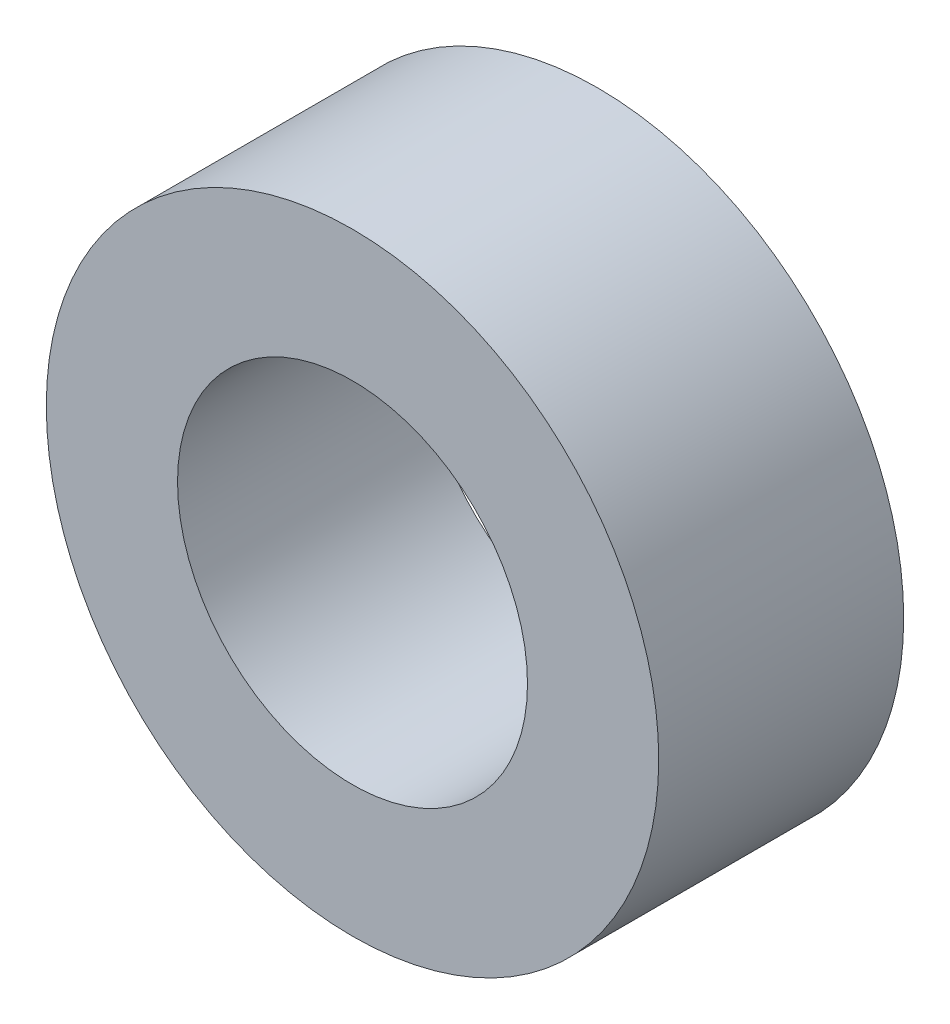
ISO-10303-21;
HEADER;
FILE_DESCRIPTION(('STEP AP214'),'2;1');
FILE_NAME('part.step','',(''),(''),'','','');
FILE_SCHEMA(('AUTOMOTIVE_DESIGN { 1 0 10303 214 1 1 1 1 }'));
ENDSEC;
DATA;
#1=APPLICATION_CONTEXT('core data for automotive mechanical design processes');
#2=APPLICATION_PROTOCOL_DEFINITION('international standard','automotive_design',2000,#1);
#3=PRODUCT_CONTEXT('',#1,'mechanical');
#4=PRODUCT('Part','Part','',(#3));
#5=PRODUCT_RELATED_PRODUCT_CATEGORY('part','',(#4));
#6=PRODUCT_DEFINITION_FORMATION('','',#4);
#7=PRODUCT_DEFINITION_CONTEXT('part definition',#1,'design');
#8=PRODUCT_DEFINITION('design','',#6,#7);
#9=PRODUCT_DEFINITION_SHAPE('','',#8);
#10=(LENGTH_UNIT() NAMED_UNIT(*) SI_UNIT(.MILLI.,.METRE.));
#11=(NAMED_UNIT(*) PLANE_ANGLE_UNIT() SI_UNIT($,.RADIAN.));
#12=(NAMED_UNIT(*) SI_UNIT($,.STERADIAN.) SOLID_ANGLE_UNIT());
#13=UNCERTAINTY_MEASURE_WITH_UNIT(LENGTH_MEASURE(1.E-05),#10,'distance_accuracy_value','');
#14=(GEOMETRIC_REPRESENTATION_CONTEXT(3) GLOBAL_UNCERTAINTY_ASSIGNED_CONTEXT((#13)) GLOBAL_UNIT_ASSIGNED_CONTEXT((#10,
#11,#12)) REPRESENTATION_CONTEXT('',''));
#15=CARTESIAN_POINT('',(0.,0.,0.));
#16=DIRECTION('',(0.,0.,1.));
#17=DIRECTION('',(1.,0.,0.));
#18=AXIS2_PLACEMENT_3D('',#15,#16,#17);
#19=CARTESIAN_POINT('',(0.403421843265389,-40.0666634220305,14.));
#20=DIRECTION('',(0.,0.,1.));
#21=DIRECTION('',(1.,0.,0.));
#22=AXIS2_PLACEMENT_3D('',#19,#20,#21);
#23=PLANE('',#22);
#24=CARTESIAN_POINT('',(0.403421843265389,-40.0666634220305,14.));
#25=DIRECTION('',(0.,0.,1.));
#26=DIRECTION('',(1.,0.,0.));
#27=AXIS2_PLACEMENT_3D('',#24,#25,#26);
#28=CIRCLE('',#27,17.5);
#29=CARTESIAN_POINT('',(17.9034218432654,-40.0666634220305,14.));
#30=VERTEX_POINT('',#29);
#31=EDGE_CURVE('E10',#30,#30,#28,.T.);
#32=ORIENTED_EDGE('',*,*,#31,.T.);
#33=EDGE_LOOP('',(#32));
#34=FACE_BOUND('',#33,.T.);
#35=CARTESIAN_POINT('',(0.403421843265389,-40.0666634220305,14.));
#36=DIRECTION('',(0.,0.,1.));
#37=DIRECTION('',(1.,0.,0.));
#38=AXIS2_PLACEMENT_3D('',#35,#36,#37);
#39=CIRCLE('',#38,10.);
#40=CARTESIAN_POINT('',(10.4034218432654,-40.0666634220305,14.));
#41=VERTEX_POINT('',#40);
#42=EDGE_CURVE('E45',#41,#41,#39,.T.);
#43=ORIENTED_EDGE('',*,*,#42,.F.);
#44=EDGE_LOOP('',(#43));
#45=FACE_BOUND('',#44,.T.);
#46=ADVANCED_FACE('F34',(#34,#45),#23,.T.);
#47=CARTESIAN_POINT('',(0.403421843265389,-40.0666634220305,0.));
#48=DIRECTION('',(0.,0.,1.));
#49=DIRECTION('',(1.,0.,0.));
#50=AXIS2_PLACEMENT_3D('',#47,#48,#49);
#51=PLANE('',#50);
#52=CARTESIAN_POINT('',(0.403421843265389,-40.0666634220305,0.));
#53=DIRECTION('',(0.,0.,1.));
#54=DIRECTION('',(1.,0.,0.));
#55=AXIS2_PLACEMENT_3D('',#52,#53,#54);
#56=CIRCLE('',#55,17.5);
#57=CARTESIAN_POINT('',(17.9034218432654,-40.0666634220305,0.));
#58=VERTEX_POINT('',#57);
#59=EDGE_CURVE('E38',#58,#58,#56,.T.);
#60=ORIENTED_EDGE('',*,*,#59,.F.);
#61=EDGE_LOOP('',(#60));
#62=FACE_BOUND('',#61,.T.);
#63=CARTESIAN_POINT('',(0.403421843265389,-40.0666634220305,0.));
#64=DIRECTION('',(0.,0.,1.));
#65=DIRECTION('',(1.,0.,0.));
#66=AXIS2_PLACEMENT_3D('',#63,#64,#65);
#67=CIRCLE('',#66,10.);
#68=CARTESIAN_POINT('',(10.4034218432654,-40.0666634220305,0.));
#69=VERTEX_POINT('',#68);
#70=EDGE_CURVE('E47',#69,#69,#67,.T.);
#71=ORIENTED_EDGE('',*,*,#70,.T.);
#72=EDGE_LOOP('',(#71));
#73=FACE_BOUND('',#72,.T.);
#74=ADVANCED_FACE('F57',(#62,#73),#51,.F.);
#75=CARTESIAN_POINT('',(0.403421843265389,-40.0666634220305,14.));
#76=DIRECTION('',(0.,0.,-1.));
#77=DIRECTION('',(-1.,0.,0.));
#78=AXIS2_PLACEMENT_3D('',#75,#76,#77);
#79=CYLINDRICAL_SURFACE('',#78,17.5);
#80=ORIENTED_EDGE('',*,*,#31,.F.);
#81=EDGE_LOOP('',(#80));
#82=FACE_BOUND('',#81,.T.);
#83=ORIENTED_EDGE('',*,*,#59,.T.);
#84=EDGE_LOOP('',(#83));
#85=FACE_BOUND('',#84,.T.);
#86=ADVANCED_FACE('F36',(#82,#85),#79,.T.);
#87=CARTESIAN_POINT('',(0.403421843265389,-40.0666634220305,14.));
#88=DIRECTION('',(0.,0.,-1.));
#89=DIRECTION('',(-1.,0.,0.));
#90=AXIS2_PLACEMENT_3D('',#87,#88,#89);
#91=CYLINDRICAL_SURFACE('',#90,10.);
#92=ORIENTED_EDGE('',*,*,#42,.T.);
#93=EDGE_LOOP('',(#92));
#94=FACE_BOUND('',#93,.T.);
#95=ORIENTED_EDGE('',*,*,#70,.F.);
#96=EDGE_LOOP('',(#95));
#97=FACE_BOUND('',#96,.T.);
#98=ADVANCED_FACE('F53',(#94,#97),#91,.F.);
#99=CLOSED_SHELL('',(#46,#74,#86,#98));
#100=MANIFOLD_SOLID_BREP('B2',#99);
#101=ADVANCED_BREP_SHAPE_REPRESENTATION('',(#18,#100),#14);
#102=SHAPE_DEFINITION_REPRESENTATION(#9,#101);
ENDSEC;
END-ISO-10303-21;
